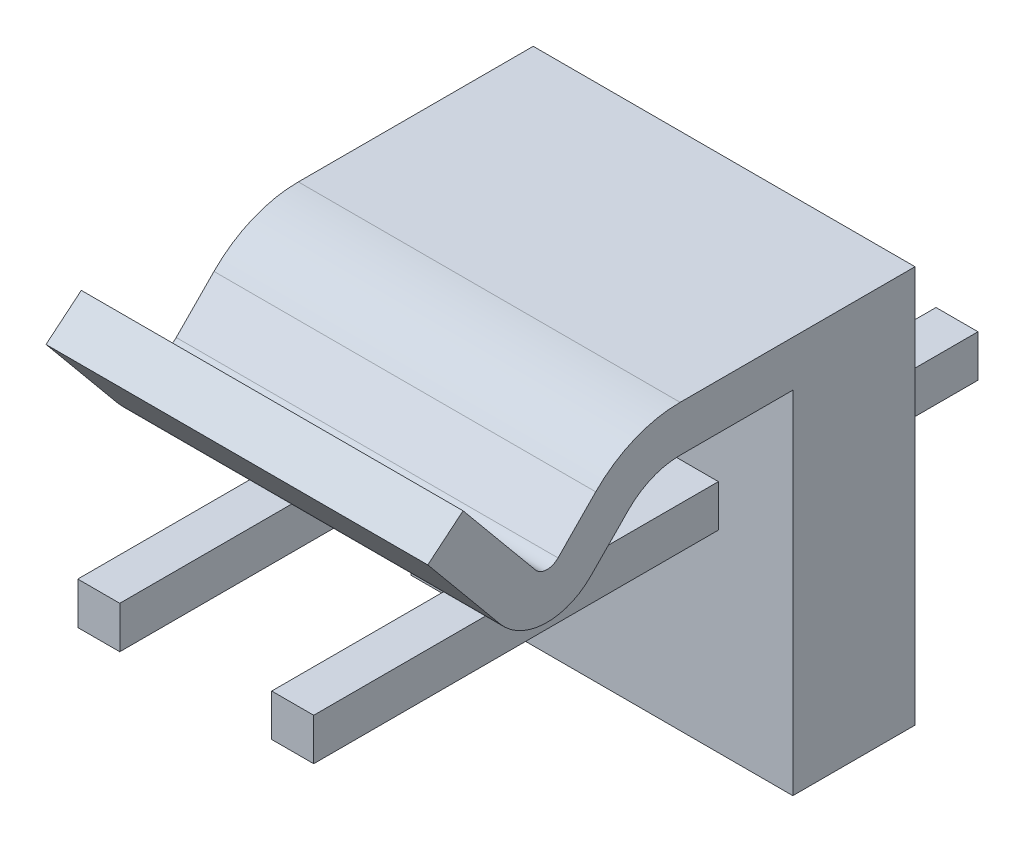
ISO-10303-21;
HEADER;
FILE_DESCRIPTION(('STEP AP214'),'2;1');
FILE_NAME('part.step','',(''),(''),'','','');
FILE_SCHEMA(('AUTOMOTIVE_DESIGN { 1 0 10303 214 1 1 1 1 }'));
ENDSEC;
DATA;
#1=APPLICATION_CONTEXT('core data for automotive mechanical design processes');
#2=APPLICATION_PROTOCOL_DEFINITION('international standard','automotive_design',2000,#1);
#3=PRODUCT_CONTEXT('',#1,'mechanical');
#4=PRODUCT('Part','Part','',(#3));
#5=PRODUCT_RELATED_PRODUCT_CATEGORY('part','',(#4));
#6=PRODUCT_DEFINITION_FORMATION('','',#4);
#7=PRODUCT_DEFINITION_CONTEXT('part definition',#1,'design');
#8=PRODUCT_DEFINITION('design','',#6,#7);
#9=PRODUCT_DEFINITION_SHAPE('','',#8);
#10=(LENGTH_UNIT() NAMED_UNIT(*) SI_UNIT(.MILLI.,.METRE.));
#11=(NAMED_UNIT(*) PLANE_ANGLE_UNIT() SI_UNIT($,.RADIAN.));
#12=(NAMED_UNIT(*) SI_UNIT($,.STERADIAN.) SOLID_ANGLE_UNIT());
#13=UNCERTAINTY_MEASURE_WITH_UNIT(LENGTH_MEASURE(1.E-05),#10,'distance_accuracy_value','');
#14=(GEOMETRIC_REPRESENTATION_CONTEXT(3) GLOBAL_UNCERTAINTY_ASSIGNED_CONTEXT((#13)) GLOBAL_UNIT_ASSIGNED_CONTEXT((#10,
#11,#12)) REPRESENTATION_CONTEXT('',''));
#15=CARTESIAN_POINT('',(0.,0.,0.));
#16=DIRECTION('',(0.,0.,1.));
#17=DIRECTION('',(1.,0.,0.));
#18=AXIS2_PLACEMENT_3D('',#15,#16,#17);
#19=CARTESIAN_POINT('',(12.58,4.8,3.2));
#20=DIRECTION('',(0.,-1.,0.));
#21=DIRECTION('',(0.,0.,-1.));
#22=AXIS2_PLACEMENT_3D('',#19,#20,#21);
#23=PLANE('',#22);
#24=DIRECTION('',(-1.,0.,0.));
#25=VECTOR('',#24,1.);
#26=CARTESIAN_POINT('',(-2.42,4.8,6.15256593385051));
#27=LINE('',#26,#25);
#28=CARTESIAN_POINT('',(7.58,4.8,6.15256593385051));
#29=VERTEX_POINT('',#28);
#30=CARTESIAN_POINT('',(-2.42,4.8,6.15256593385051));
#31=VERTEX_POINT('',#30);
#32=EDGE_CURVE('E377',#29,#31,#27,.T.);
#33=ORIENTED_EDGE('',*,*,#32,.F.);
#34=DIRECTION('',(0.,0.,-1.));
#35=VECTOR('',#34,1.);
#36=CARTESIAN_POINT('',(7.58,4.8,3.2));
#37=LINE('',#36,#35);
#38=CARTESIAN_POINT('',(7.58,4.8,0.));
#39=VERTEX_POINT('',#38);
#40=EDGE_CURVE('E430',#29,#39,#37,.T.);
#41=ORIENTED_EDGE('',*,*,#40,.T.);
#42=DIRECTION('',(-1.,0.,0.));
#43=VECTOR('',#42,1.);
#44=CARTESIAN_POINT('',(12.58,4.8,0.));
#45=LINE('',#44,#43);
#46=CARTESIAN_POINT('',(-2.42,4.8,0.));
#47=VERTEX_POINT('',#46);
#48=EDGE_CURVE('E358',#39,#47,#45,.T.);
#49=ORIENTED_EDGE('',*,*,#48,.T.);
#50=DIRECTION('',(0.,0.,-1.));
#51=VECTOR('',#50,1.);
#52=CARTESIAN_POINT('',(-2.42,4.8,3.2));
#53=LINE('',#52,#51);
#54=EDGE_CURVE('E461',#31,#47,#53,.T.);
#55=ORIENTED_EDGE('',*,*,#54,.F.);
#56=EDGE_LOOP('',(#33,#41,#49,#55));
#57=FACE_BOUND('',#56,.T.);
#58=ADVANCED_FACE('F33',(#57),#23,.F.);
#59=CARTESIAN_POINT('',(-2.42,4.8,3.2));
#60=DIRECTION('',(1.,0.,0.));
#61=DIRECTION('',(0.,0.,-1.));
#62=AXIS2_PLACEMENT_3D('',#59,#60,#61);
#63=PLANE('',#62);
#64=DIRECTION('',(0.,-1.,0.));
#65=VECTOR('',#64,1.);
#66=CARTESIAN_POINT('',(-2.42,4.8,0.));
#67=LINE('',#66,#65);
#68=CARTESIAN_POINT('',(-2.42,-5.6,0.));
#69=VERTEX_POINT('',#68);
#70=EDGE_CURVE('E580',#47,#69,#67,.T.);
#71=ORIENTED_EDGE('',*,*,#70,.T.);
#72=DIRECTION('',(0.,0.,-1.));
#73=VECTOR('',#72,1.);
#74=CARTESIAN_POINT('',(-2.42,-5.6,3.2));
#75=LINE('',#74,#73);
#76=CARTESIAN_POINT('',(-2.42,-5.6,3.2));
#77=VERTEX_POINT('',#76);
#78=EDGE_CURVE('E455',#77,#69,#75,.T.);
#79=ORIENTED_EDGE('',*,*,#78,.F.);
#80=DIRECTION('',(0.,-1.,0.));
#81=VECTOR('',#80,1.);
#82=CARTESIAN_POINT('',(-2.42,4.8,3.2));
#83=LINE('',#82,#81);
#84=CARTESIAN_POINT('',(-2.42,3.6,3.2));
#85=VERTEX_POINT('',#84);
#86=EDGE_CURVE('E364',#85,#77,#83,.T.);
#87=ORIENTED_EDGE('',*,*,#86,.F.);
#88=DIRECTION('',(0.,0.,-1.));
#89=VECTOR('',#88,1.);
#90=CARTESIAN_POINT('',(-2.42,3.6,6.15256593385051));
#91=LINE('',#90,#89);
#92=CARTESIAN_POINT('',(-2.42,3.6,6.15256593385051));
#93=VERTEX_POINT('',#92);
#94=EDGE_CURVE('E373',#93,#85,#91,.T.);
#95=ORIENTED_EDGE('',*,*,#94,.F.);
#96=CARTESIAN_POINT('',(-2.42,1.7,6.15256593385051));
#97=DIRECTION('',(1.,0.,0.));
#98=DIRECTION('',(0.,0.,-1.));
#99=AXIS2_PLACEMENT_3D('',#96,#97,#98);
#100=CIRCLE('',#99,1.9);
#101=CARTESIAN_POINT('',(-2.42,3.03255997829624,7.50692331070609));
#102=VERTEX_POINT('',#101);
#103=EDGE_CURVE('E387',#93,#102,#100,.T.);
#104=ORIENTED_EDGE('',*,*,#103,.T.);
#105=DIRECTION('',(0.,-0.712819672029253,0.70134735699802));
#106=VECTOR('',#105,1.);
#107=CARTESIAN_POINT('',(-2.42,3.03255997829624,7.50692331070609));
#108=LINE('',#107,#106);
#109=CARTESIAN_POINT('',(-2.42,2.02784422880317,8.49546888975168));
#110=VERTEX_POINT('',#109);
#111=EDGE_CURVE('E398',#102,#110,#108,.T.);
#112=ORIENTED_EDGE('',*,*,#111,.T.);
#113=CARTESIAN_POINT('',(-2.42,3.15,9.63598036499848));
#114=DIRECTION('',(-1.,0.,0.));
#115=DIRECTION('',(0.,0.,1.));
#116=AXIS2_PLACEMENT_3D('',#113,#114,#115);
#117=CIRCLE('',#116,1.6);
#118=CARTESIAN_POINT('',(-2.42,2.12974270931486,10.8684879961326));
#119=VERTEX_POINT('',#118);
#120=EDGE_CURVE('E407',#110,#119,#117,.T.);
#121=ORIENTED_EDGE('',*,*,#120,.T.);
#122=DIRECTION('',(0.,0.77031726945882,0.637660806678212));
#123=VECTOR('',#122,1.);
#124=CARTESIAN_POINT('',(-2.42,2.12974270931486,10.8684879961326));
#125=LINE('',#124,#123);
#126=CARTESIAN_POINT('',(-2.42,4.41740351599307,12.7621903616753));
#127=VERTEX_POINT('',#126);
#128=EDGE_CURVE('E250',#119,#127,#125,.T.);
#129=ORIENTED_EDGE('',*,*,#128,.T.);
#130=DIRECTION('',(0.,-0.637660806678213,0.770317269458819));
#131=VECTOR('',#130,1.);
#132=CARTESIAN_POINT('',(-2.42,5.18259648400693,11.8378096383247));
#133=LINE('',#132,#131);
#134=CARTESIAN_POINT('',(-2.42,5.18259648400693,11.8378096383247));
#135=VERTEX_POINT('',#134);
#136=EDGE_CURVE('E244',#135,#127,#133,.T.);
#137=ORIENTED_EDGE('',*,*,#136,.F.);
#138=DIRECTION('',(0.,0.77031726945882,0.637660806678212));
#139=VECTOR('',#138,1.);
#140=CARTESIAN_POINT('',(-2.42,2.89493567732872,9.94410727278201));
#141=LINE('',#140,#139);
#142=CARTESIAN_POINT('',(-2.42,2.89493567732872,9.94410727278201));
#143=VERTEX_POINT('',#142);
#144=EDGE_CURVE('E246',#143,#135,#141,.T.);
#145=ORIENTED_EDGE('',*,*,#144,.F.);
#146=CARTESIAN_POINT('',(-2.42,3.15,9.63598036499848));
#147=DIRECTION('',(-1.,0.,0.));
#148=DIRECTION('',(0.,0.,1.));
#149=AXIS2_PLACEMENT_3D('',#146,#147,#148);
#150=CIRCLE('',#149,0.399999999999999);
#151=CARTESIAN_POINT('',(-2.42,2.86946105720079,9.35085249618678));
#152=VERTEX_POINT('',#151);
#153=EDGE_CURVE('E404',#152,#143,#150,.T.);
#154=ORIENTED_EDGE('',*,*,#153,.F.);
#155=DIRECTION('',(0.,-0.712819672029253,0.70134735699802));
#156=VECTOR('',#155,1.);
#157=CARTESIAN_POINT('',(-2.42,3.87417680669386,8.36230691714119));
#158=LINE('',#157,#156);
#159=CARTESIAN_POINT('',(-2.42,3.87417680669386,8.36230691714119));
#160=VERTEX_POINT('',#159);
#161=EDGE_CURVE('E395',#160,#152,#158,.T.);
#162=ORIENTED_EDGE('',*,*,#161,.F.);
#163=CARTESIAN_POINT('',(-2.42,1.7,6.15256593385051));
#164=DIRECTION('',(1.,0.,0.));
#165=DIRECTION('',(0.,0.,-1.));
#166=AXIS2_PLACEMENT_3D('',#163,#164,#165);
#167=CIRCLE('',#166,3.1);
#168=EDGE_CURVE('E384',#31,#160,#167,.T.);
#169=ORIENTED_EDGE('',*,*,#168,.F.);
#170=ORIENTED_EDGE('',*,*,#54,.T.);
#171=EDGE_LOOP('',(#71,#79,#87,#95,#104,#112,#121,#129,#137,#145,#154,#162,#169,#170));
#172=FACE_BOUND('',#171,.T.);
#173=ADVANCED_FACE('F410',(#172),#63,.F.);
#174=CARTESIAN_POINT('',(-2.42,-5.6,3.2));
#175=DIRECTION('',(0.,1.,0.));
#176=DIRECTION('',(0.,0.,1.));
#177=AXIS2_PLACEMENT_3D('',#174,#175,#176);
#178=PLANE('',#177);
#179=DIRECTION('',(1.,0.,0.));
#180=VECTOR('',#179,1.);
#181=CARTESIAN_POINT('',(-2.42,-5.6,0.));
#182=LINE('',#181,#180);
#183=CARTESIAN_POINT('',(7.58,-5.6,0.));
#184=VERTEX_POINT('',#183);
#185=EDGE_CURVE('E367',#69,#184,#182,.T.);
#186=ORIENTED_EDGE('',*,*,#185,.T.);
#187=DIRECTION('',(0.,0.,1.));
#188=VECTOR('',#187,1.);
#189=CARTESIAN_POINT('',(7.58,-5.6,3.2));
#190=LINE('',#189,#188);
#191=CARTESIAN_POINT('',(7.58,-5.6,3.2));
#192=VERTEX_POINT('',#191);
#193=EDGE_CURVE('E372',#184,#192,#190,.T.);
#194=ORIENTED_EDGE('',*,*,#193,.T.);
#195=DIRECTION('',(1.,0.,0.));
#196=VECTOR('',#195,1.);
#197=CARTESIAN_POINT('',(-2.42,-5.6,3.2));
#198=LINE('',#197,#196);
#199=EDGE_CURVE('E361',#77,#192,#198,.T.);
#200=ORIENTED_EDGE('',*,*,#199,.F.);
#201=ORIENTED_EDGE('',*,*,#78,.T.);
#202=EDGE_LOOP('',(#186,#194,#200,#201));
#203=FACE_BOUND('',#202,.T.);
#204=ADVANCED_FACE('F526',(#203),#178,.F.);
#205=CARTESIAN_POINT('',(-2.42,4.8,3.2));
#206=DIRECTION('',(0.,0.,1.));
#207=DIRECTION('',(1.,0.,0.));
#208=AXIS2_PLACEMENT_3D('',#205,#206,#207);
#209=PLANE('',#208);
#210=DIRECTION('',(0.,-1.,0.));
#211=VECTOR('',#210,1.);
#212=CARTESIAN_POINT('',(7.58,4.8,3.2));
#213=LINE('',#212,#211);
#214=CARTESIAN_POINT('',(7.58,3.6,3.2));
#215=VERTEX_POINT('',#214);
#216=EDGE_CURVE('E439',#215,#192,#213,.T.);
#217=ORIENTED_EDGE('',*,*,#216,.F.);
#218=DIRECTION('',(1.,0.,0.));
#219=VECTOR('',#218,1.);
#220=CARTESIAN_POINT('',(-2.42,3.6,3.2));
#221=LINE('',#220,#219);
#222=EDGE_CURVE('E54',#85,#215,#221,.T.);
#223=ORIENTED_EDGE('',*,*,#222,.F.);
#224=ORIENTED_EDGE('',*,*,#86,.T.);
#225=ORIENTED_EDGE('',*,*,#199,.T.);
#226=EDGE_LOOP('',(#217,#223,#224,#225));
#227=FACE_BOUND('',#226,.T.);
#228=DIRECTION('',(0.,-1.,0.));
#229=VECTOR('',#228,1.);
#230=CARTESIAN_POINT('',(4.53,4.8,3.2));
#231=LINE('',#230,#229);
#232=CARTESIAN_POINT('',(4.53,0.55,3.2));
#233=VERTEX_POINT('',#232);
#234=CARTESIAN_POINT('',(4.53,-0.55,3.2));
#235=VERTEX_POINT('',#234);
#236=EDGE_CURVE('E304',#233,#235,#231,.T.);
#237=ORIENTED_EDGE('',*,*,#236,.F.);
#238=DIRECTION('',(-1.,0.,0.));
#239=VECTOR('',#238,1.);
#240=CARTESIAN_POINT('',(-2.42,0.55,3.2));
#241=LINE('',#240,#239);
#242=CARTESIAN_POINT('',(5.63,0.55,3.2));
#243=VERTEX_POINT('',#242);
#244=EDGE_CURVE('E301',#243,#233,#241,.T.);
#245=ORIENTED_EDGE('',*,*,#244,.F.);
#246=DIRECTION('',(0.,1.,0.));
#247=VECTOR('',#246,1.);
#248=CARTESIAN_POINT('',(5.63,4.8,3.2));
#249=LINE('',#248,#247);
#250=CARTESIAN_POINT('',(5.63,-0.55,3.2));
#251=VERTEX_POINT('',#250);
#252=EDGE_CURVE('E298',#251,#243,#249,.T.);
#253=ORIENTED_EDGE('',*,*,#252,.F.);
#254=DIRECTION('',(1.,0.,0.));
#255=VECTOR('',#254,1.);
#256=CARTESIAN_POINT('',(-2.42,-0.55,3.2));
#257=LINE('',#256,#255);
#258=EDGE_CURVE('E284',#235,#251,#257,.T.);
#259=ORIENTED_EDGE('',*,*,#258,.F.);
#260=EDGE_LOOP('',(#237,#245,#253,#259));
#261=FACE_BOUND('',#260,.T.);
#262=DIRECTION('',(0.,-1.,0.));
#263=VECTOR('',#262,1.);
#264=CARTESIAN_POINT('',(-0.55,4.8,3.2));
#265=LINE('',#264,#263);
#266=CARTESIAN_POINT('',(-0.55,0.55,3.2));
#267=VERTEX_POINT('',#266);
#268=CARTESIAN_POINT('',(-0.55,-0.55,3.2));
#269=VERTEX_POINT('',#268);
#270=EDGE_CURVE('E355',#267,#269,#265,.T.);
#271=ORIENTED_EDGE('',*,*,#270,.F.);
#272=DIRECTION('',(-1.,0.,0.));
#273=VECTOR('',#272,1.);
#274=CARTESIAN_POINT('',(-2.42,0.55,3.2));
#275=LINE('',#274,#273);
#276=CARTESIAN_POINT('',(0.55,0.55,3.2));
#277=VERTEX_POINT('',#276);
#278=EDGE_CURVE('E352',#277,#267,#275,.T.);
#279=ORIENTED_EDGE('',*,*,#278,.F.);
#280=DIRECTION('',(0.,1.,0.));
#281=VECTOR('',#280,1.);
#282=CARTESIAN_POINT('',(0.55,4.8,3.2));
#283=LINE('',#282,#281);
#284=CARTESIAN_POINT('',(0.55,-0.55,3.2));
#285=VERTEX_POINT('',#284);
#286=EDGE_CURVE('E349',#285,#277,#283,.T.);
#287=ORIENTED_EDGE('',*,*,#286,.F.);
#288=DIRECTION('',(1.,0.,0.));
#289=VECTOR('',#288,1.);
#290=CARTESIAN_POINT('',(-2.42,-0.55,3.2));
#291=LINE('',#290,#289);
#292=EDGE_CURVE('E335',#269,#285,#291,.T.);
#293=ORIENTED_EDGE('',*,*,#292,.F.);
#294=EDGE_LOOP('',(#271,#279,#287,#293));
#295=FACE_BOUND('',#294,.T.);
#296=ADVANCED_FACE('F458',(#227,#261,#295),#209,.T.);
#297=CARTESIAN_POINT('',(-2.42,4.8,0.));
#298=DIRECTION('',(0.,0.,1.));
#299=DIRECTION('',(1.,0.,0.));
#300=AXIS2_PLACEMENT_3D('',#297,#298,#299);
#301=PLANE('',#300);
#302=DIRECTION('',(-1.,0.,0.));
#303=VECTOR('',#302,1.);
#304=CARTESIAN_POINT('',(-2.42,0.55,0.));
#305=LINE('',#304,#303);
#306=CARTESIAN_POINT('',(5.63,0.55,0.));
#307=VERTEX_POINT('',#306);
#308=CARTESIAN_POINT('',(4.53,0.55,0.));
#309=VERTEX_POINT('',#308);
#310=EDGE_CURVE('E487',#307,#309,#305,.T.);
#311=ORIENTED_EDGE('',*,*,#310,.T.);
#312=DIRECTION('',(0.,-1.,0.));
#313=VECTOR('',#312,1.);
#314=CARTESIAN_POINT('',(4.53,4.8,0.));
#315=LINE('',#314,#313);
#316=CARTESIAN_POINT('',(4.53,-0.55,0.));
#317=VERTEX_POINT('',#316);
#318=EDGE_CURVE('E40',#309,#317,#315,.T.);
#319=ORIENTED_EDGE('',*,*,#318,.T.);
#320=DIRECTION('',(1.,0.,0.));
#321=VECTOR('',#320,1.);
#322=CARTESIAN_POINT('',(-2.42,-0.55,0.));
#323=LINE('',#322,#321);
#324=CARTESIAN_POINT('',(5.63,-0.55,0.));
#325=VERTEX_POINT('',#324);
#326=EDGE_CURVE('E482',#317,#325,#323,.T.);
#327=ORIENTED_EDGE('',*,*,#326,.T.);
#328=DIRECTION('',(0.,1.,0.));
#329=VECTOR('',#328,1.);
#330=CARTESIAN_POINT('',(5.63,4.8,0.));
#331=LINE('',#330,#329);
#332=EDGE_CURVE('E485',#325,#307,#331,.T.);
#333=ORIENTED_EDGE('',*,*,#332,.T.);
#334=EDGE_LOOP('',(#311,#319,#327,#333));
#335=FACE_BOUND('',#334,.T.);
#336=DIRECTION('',(-1.,0.,0.));
#337=VECTOR('',#336,1.);
#338=CARTESIAN_POINT('',(-2.42,0.55,0.));
#339=LINE('',#338,#337);
#340=CARTESIAN_POINT('',(0.55,0.55,0.));
#341=VERTEX_POINT('',#340);
#342=CARTESIAN_POINT('',(-0.55,0.55,0.));
#343=VERTEX_POINT('',#342);
#344=EDGE_CURVE('E476',#341,#343,#339,.T.);
#345=ORIENTED_EDGE('',*,*,#344,.T.);
#346=DIRECTION('',(0.,-1.,0.));
#347=VECTOR('',#346,1.);
#348=CARTESIAN_POINT('',(-0.55,4.8,0.));
#349=LINE('',#348,#347);
#350=CARTESIAN_POINT('',(-0.55,-0.55,0.));
#351=VERTEX_POINT('',#350);
#352=EDGE_CURVE('E479',#343,#351,#349,.T.);
#353=ORIENTED_EDGE('',*,*,#352,.T.);
#354=DIRECTION('',(1.,0.,0.));
#355=VECTOR('',#354,1.);
#356=CARTESIAN_POINT('',(-2.42,-0.55,0.));
#357=LINE('',#356,#355);
#358=CARTESIAN_POINT('',(0.55,-0.55,0.));
#359=VERTEX_POINT('',#358);
#360=EDGE_CURVE('E466',#351,#359,#357,.T.);
#361=ORIENTED_EDGE('',*,*,#360,.T.);
#362=DIRECTION('',(0.,1.,0.));
#363=VECTOR('',#362,1.);
#364=CARTESIAN_POINT('',(0.55,4.8,0.));
#365=LINE('',#364,#363);
#366=EDGE_CURVE('E473',#359,#341,#365,.T.);
#367=ORIENTED_EDGE('',*,*,#366,.T.);
#368=EDGE_LOOP('',(#345,#353,#361,#367));
#369=FACE_BOUND('',#368,.T.);
#370=ORIENTED_EDGE('',*,*,#48,.F.);
#371=DIRECTION('',(0.,-1.,0.));
#372=VECTOR('',#371,1.);
#373=CARTESIAN_POINT('',(7.58,4.8,0.));
#374=LINE('',#373,#372);
#375=EDGE_CURVE('E436',#39,#184,#374,.T.);
#376=ORIENTED_EDGE('',*,*,#375,.T.);
#377=ORIENTED_EDGE('',*,*,#185,.F.);
#378=ORIENTED_EDGE('',*,*,#70,.F.);
#379=EDGE_LOOP('',(#370,#376,#377,#378));
#380=FACE_BOUND('',#379,.T.);
#381=ADVANCED_FACE('F491',(#335,#369,#380),#301,.F.);
#382=CARTESIAN_POINT('',(-0.55,-0.55,-3.6));
#383=DIRECTION('',(0.,0.,1.));
#384=DIRECTION('',(1.,0.,0.));
#385=AXIS2_PLACEMENT_3D('',#382,#383,#384);
#386=PLANE('',#385);
#387=CARTESIAN_POINT('',(0.,0.,-3.6));
#388=DIRECTION('',(0.,0.,-1.));
#389=DIRECTION('',(-1.,0.,0.));
#390=AXIS2_PLACEMENT_3D('',#387,#388,#389);
#391=CIRCLE('',#390,0.25);
#392=CARTESIAN_POINT('',(-0.25,0.,-3.6));
#393=VERTEX_POINT('',#392);
#394=EDGE_CURVE('E546',#393,#393,#391,.T.);
#395=ORIENTED_EDGE('',*,*,#394,.F.);
#396=EDGE_LOOP('',(#395));
#397=FACE_BOUND('',#396,.T.);
#398=DIRECTION('',(0.,-1.,0.));
#399=VECTOR('',#398,1.);
#400=CARTESIAN_POINT('',(-0.55,0.55,-3.6));
#401=LINE('',#400,#399);
#402=CARTESIAN_POINT('',(-0.55,0.55,-3.6));
#403=VERTEX_POINT('',#402);
#404=CARTESIAN_POINT('',(-0.55,-0.55,-3.6));
#405=VERTEX_POINT('',#404);
#406=EDGE_CURVE('E319',#403,#405,#401,.T.);
#407=ORIENTED_EDGE('',*,*,#406,.F.);
#408=DIRECTION('',(-1.,0.,0.));
#409=VECTOR('',#408,1.);
#410=CARTESIAN_POINT('',(-0.55,0.55,-3.6));
#411=LINE('',#410,#409);
#412=CARTESIAN_POINT('',(0.55,0.55,-3.6));
#413=VERTEX_POINT('',#412);
#414=EDGE_CURVE('E328',#413,#403,#411,.T.);
#415=ORIENTED_EDGE('',*,*,#414,.F.);
#416=DIRECTION('',(0.,1.,0.));
#417=VECTOR('',#416,1.);
#418=CARTESIAN_POINT('',(0.55,0.55,-3.6));
#419=LINE('',#418,#417);
#420=CARTESIAN_POINT('',(0.55,-0.55,-3.6));
#421=VERTEX_POINT('',#420);
#422=EDGE_CURVE('E325',#421,#413,#419,.T.);
#423=ORIENTED_EDGE('',*,*,#422,.F.);
#424=DIRECTION('',(1.,0.,0.));
#425=VECTOR('',#424,1.);
#426=CARTESIAN_POINT('',(-0.55,-0.55,-3.6));
#427=LINE('',#426,#425);
#428=EDGE_CURVE('E322',#405,#421,#427,.T.);
#429=ORIENTED_EDGE('',*,*,#428,.F.);
#430=EDGE_LOOP('',(#407,#415,#423,#429));
#431=FACE_BOUND('',#430,.T.);
#432=ADVANCED_FACE('F560',(#397,#431),#386,.F.);
#433=CARTESIAN_POINT('',(-0.55,-0.55,-3.6));
#434=DIRECTION('',(0.,-1.,0.));
#435=DIRECTION('',(0.,0.,-1.));
#436=AXIS2_PLACEMENT_3D('',#433,#434,#435);
#437=PLANE('',#436);
#438=ORIENTED_EDGE('',*,*,#360,.F.);
#439=DIRECTION('',(0.,0.,1.));
#440=VECTOR('',#439,1.);
#441=CARTESIAN_POINT('',(-0.55,-0.55,-3.6));
#442=LINE('',#441,#440);
#443=EDGE_CURVE('E344',#405,#351,#442,.T.);
#444=ORIENTED_EDGE('',*,*,#443,.F.);
#445=ORIENTED_EDGE('',*,*,#428,.T.);
#446=DIRECTION('',(0.,0.,1.));
#447=VECTOR('',#446,1.);
#448=CARTESIAN_POINT('',(0.55,-0.55,-3.6));
#449=LINE('',#448,#447);
#450=EDGE_CURVE('E341',#421,#359,#449,.T.);
#451=ORIENTED_EDGE('',*,*,#450,.T.);
#452=EDGE_LOOP('',(#438,#444,#445,#451));
#453=FACE_BOUND('',#452,.T.);
#454=ADVANCED_FACE('F563',(#453),#437,.T.);
#455=CARTESIAN_POINT('',(0.55,0.55,-3.6));
#456=DIRECTION('',(1.,0.,0.));
#457=DIRECTION('',(0.,0.,-1.));
#458=AXIS2_PLACEMENT_3D('',#455,#456,#457);
#459=PLANE('',#458);
#460=ORIENTED_EDGE('',*,*,#366,.F.);
#461=ORIENTED_EDGE('',*,*,#450,.F.);
#462=ORIENTED_EDGE('',*,*,#422,.T.);
#463=DIRECTION('',(0.,0.,1.));
#464=VECTOR('',#463,1.);
#465=CARTESIAN_POINT('',(0.55,0.55,-3.6));
#466=LINE('',#465,#464);
#467=EDGE_CURVE('E337',#413,#341,#466,.T.);
#468=ORIENTED_EDGE('',*,*,#467,.T.);
#469=EDGE_LOOP('',(#460,#461,#462,#468));
#470=FACE_BOUND('',#469,.T.);
#471=ADVANCED_FACE('F574',(#470),#459,.T.);
#472=CARTESIAN_POINT('',(-0.55,0.55,-3.6));
#473=DIRECTION('',(0.,1.,0.));
#474=DIRECTION('',(0.,0.,1.));
#475=AXIS2_PLACEMENT_3D('',#472,#473,#474);
#476=PLANE('',#475);
#477=ORIENTED_EDGE('',*,*,#344,.F.);
#478=ORIENTED_EDGE('',*,*,#467,.F.);
#479=ORIENTED_EDGE('',*,*,#414,.T.);
#480=DIRECTION('',(0.,0.,1.));
#481=VECTOR('',#480,1.);
#482=CARTESIAN_POINT('',(-0.55,0.55,-3.6));
#483=LINE('',#482,#481);
#484=EDGE_CURVE('E332',#403,#343,#483,.T.);
#485=ORIENTED_EDGE('',*,*,#484,.T.);
#486=EDGE_LOOP('',(#477,#478,#479,#485));
#487=FACE_BOUND('',#486,.T.);
#488=ADVANCED_FACE('F571',(#487),#476,.T.);
#489=CARTESIAN_POINT('',(-0.55,0.55,-3.6));
#490=DIRECTION('',(-1.,0.,0.));
#491=DIRECTION('',(0.,0.,1.));
#492=AXIS2_PLACEMENT_3D('',#489,#490,#491);
#493=PLANE('',#492);
#494=ORIENTED_EDGE('',*,*,#352,.F.);
#495=ORIENTED_EDGE('',*,*,#484,.F.);
#496=ORIENTED_EDGE('',*,*,#406,.T.);
#497=ORIENTED_EDGE('',*,*,#443,.T.);
#498=EDGE_LOOP('',(#494,#495,#496,#497));
#499=FACE_BOUND('',#498,.T.);
#500=ADVANCED_FACE('F576',(#499),#493,.T.);
#501=CARTESIAN_POINT('',(-0.55,0.55,13.8));
#502=VERTEX_POINT('',#501);
#503=EDGE_CURVE('E336',#267,#502,#483,.T.);
#504=ORIENTED_EDGE('',*,*,#503,.F.);
#505=ORIENTED_EDGE('',*,*,#270,.T.);
#506=CARTESIAN_POINT('',(-0.55,-0.55,13.8));
#507=VERTEX_POINT('',#506);
#508=EDGE_CURVE('E331',#269,#507,#442,.T.);
#509=ORIENTED_EDGE('',*,*,#508,.T.);
#510=DIRECTION('',(0.,-1.,0.));
#511=VECTOR('',#510,1.);
#512=CARTESIAN_POINT('',(-0.55,0.55,13.8));
#513=LINE('',#512,#511);
#514=EDGE_CURVE('E307',#502,#507,#513,.T.);
#515=ORIENTED_EDGE('',*,*,#514,.F.);
#516=EDGE_LOOP('',(#504,#505,#509,#515));
#517=FACE_BOUND('',#516,.T.);
#518=ADVANCED_FACE('F638',(#517),#493,.T.);
#519=CARTESIAN_POINT('',(0.55,0.55,13.8));
#520=VERTEX_POINT('',#519);
#521=EDGE_CURVE('E340',#277,#520,#466,.T.);
#522=ORIENTED_EDGE('',*,*,#521,.F.);
#523=ORIENTED_EDGE('',*,*,#278,.T.);
#524=ORIENTED_EDGE('',*,*,#503,.T.);
#525=DIRECTION('',(-1.,0.,0.));
#526=VECTOR('',#525,1.);
#527=CARTESIAN_POINT('',(-0.55,0.55,13.8));
#528=LINE('',#527,#526);
#529=EDGE_CURVE('E316',#520,#502,#528,.T.);
#530=ORIENTED_EDGE('',*,*,#529,.F.);
#531=EDGE_LOOP('',(#522,#523,#524,#530));
#532=FACE_BOUND('',#531,.T.);
#533=ADVANCED_FACE('F635',(#532),#476,.T.);
#534=CARTESIAN_POINT('',(0.55,-0.55,13.8));
#535=VERTEX_POINT('',#534);
#536=EDGE_CURVE('E343',#285,#535,#449,.T.);
#537=ORIENTED_EDGE('',*,*,#536,.F.);
#538=ORIENTED_EDGE('',*,*,#286,.T.);
#539=ORIENTED_EDGE('',*,*,#521,.T.);
#540=DIRECTION('',(0.,1.,0.));
#541=VECTOR('',#540,1.);
#542=CARTESIAN_POINT('',(0.55,0.55,13.8));
#543=LINE('',#542,#541);
#544=EDGE_CURVE('E313',#535,#520,#543,.T.);
#545=ORIENTED_EDGE('',*,*,#544,.F.);
#546=EDGE_LOOP('',(#537,#538,#539,#545));
#547=FACE_BOUND('',#546,.T.);
#548=ADVANCED_FACE('F644',(#547),#459,.T.);
#549=ORIENTED_EDGE('',*,*,#508,.F.);
#550=ORIENTED_EDGE('',*,*,#292,.T.);
#551=ORIENTED_EDGE('',*,*,#536,.T.);
#552=DIRECTION('',(1.,0.,0.));
#553=VECTOR('',#552,1.);
#554=CARTESIAN_POINT('',(-0.55,-0.55,13.8));
#555=LINE('',#554,#553);
#556=EDGE_CURVE('E310',#507,#535,#555,.T.);
#557=ORIENTED_EDGE('',*,*,#556,.F.);
#558=EDGE_LOOP('',(#549,#550,#551,#557));
#559=FACE_BOUND('',#558,.T.);
#560=ADVANCED_FACE('F646',(#559),#437,.T.);
#561=CARTESIAN_POINT('',(-0.55,-0.55,13.8));
#562=DIRECTION('',(0.,0.,1.));
#563=DIRECTION('',(1.,0.,0.));
#564=AXIS2_PLACEMENT_3D('',#561,#562,#563);
#565=PLANE('',#564);
#566=ORIENTED_EDGE('',*,*,#514,.T.);
#567=ORIENTED_EDGE('',*,*,#556,.T.);
#568=ORIENTED_EDGE('',*,*,#544,.T.);
#569=ORIENTED_EDGE('',*,*,#529,.T.);
#570=EDGE_LOOP('',(#566,#567,#568,#569));
#571=FACE_BOUND('',#570,.T.);
#572=ADVANCED_FACE('F609',(#571),#565,.T.);
#573=CARTESIAN_POINT('',(4.53,-0.55,-3.6));
#574=DIRECTION('',(0.,0.,1.));
#575=DIRECTION('',(1.,0.,0.));
#576=AXIS2_PLACEMENT_3D('',#573,#574,#575);
#577=PLANE('',#576);
#578=DIRECTION('',(0.,-1.,0.));
#579=VECTOR('',#578,1.);
#580=CARTESIAN_POINT('',(4.53,0.55,-3.6));
#581=LINE('',#580,#579);
#582=CARTESIAN_POINT('',(4.53,0.55,-3.6));
#583=VERTEX_POINT('',#582);
#584=CARTESIAN_POINT('',(4.53,-0.55,-3.6));
#585=VERTEX_POINT('',#584);
#586=EDGE_CURVE('E268',#583,#585,#581,.T.);
#587=ORIENTED_EDGE('',*,*,#586,.F.);
#588=DIRECTION('',(-1.,0.,0.));
#589=VECTOR('',#588,1.);
#590=CARTESIAN_POINT('',(4.53,0.55,-3.6));
#591=LINE('',#590,#589);
#592=CARTESIAN_POINT('',(5.63,0.55,-3.6));
#593=VERTEX_POINT('',#592);
#594=EDGE_CURVE('E277',#593,#583,#591,.T.);
#595=ORIENTED_EDGE('',*,*,#594,.F.);
#596=DIRECTION('',(0.,1.,0.));
#597=VECTOR('',#596,1.);
#598=CARTESIAN_POINT('',(5.63,0.55,-3.6));
#599=LINE('',#598,#597);
#600=CARTESIAN_POINT('',(5.63,-0.55,-3.6));
#601=VERTEX_POINT('',#600);
#602=EDGE_CURVE('E274',#601,#593,#599,.T.);
#603=ORIENTED_EDGE('',*,*,#602,.F.);
#604=DIRECTION('',(1.,0.,0.));
#605=VECTOR('',#604,1.);
#606=CARTESIAN_POINT('',(4.53,-0.55,-3.6));
#607=LINE('',#606,#605);
#608=EDGE_CURVE('E271',#585,#601,#607,.T.);
#609=ORIENTED_EDGE('',*,*,#608,.F.);
#610=EDGE_LOOP('',(#587,#595,#603,#609));
#611=FACE_BOUND('',#610,.T.);
#612=ADVANCED_FACE('F501',(#611),#577,.F.);
#613=CARTESIAN_POINT('',(4.53,-0.55,-3.6));
#614=DIRECTION('',(0.,-1.,0.));
#615=DIRECTION('',(0.,0.,-1.));
#616=AXIS2_PLACEMENT_3D('',#613,#614,#615);
#617=PLANE('',#616);
#618=ORIENTED_EDGE('',*,*,#326,.F.);
#619=DIRECTION('',(0.,0.,1.));
#620=VECTOR('',#619,1.);
#621=CARTESIAN_POINT('',(4.53,-0.55,-3.6));
#622=LINE('',#621,#620);
#623=EDGE_CURVE('E293',#585,#317,#622,.T.);
#624=ORIENTED_EDGE('',*,*,#623,.F.);
#625=ORIENTED_EDGE('',*,*,#608,.T.);
#626=DIRECTION('',(0.,0.,1.));
#627=VECTOR('',#626,1.);
#628=CARTESIAN_POINT('',(5.63,-0.55,-3.6));
#629=LINE('',#628,#627);
#630=EDGE_CURVE('E290',#601,#325,#629,.T.);
#631=ORIENTED_EDGE('',*,*,#630,.T.);
#632=EDGE_LOOP('',(#618,#624,#625,#631));
#633=FACE_BOUND('',#632,.T.);
#634=ADVANCED_FACE('F504',(#633),#617,.T.);
#635=CARTESIAN_POINT('',(5.63,0.55,-3.6));
#636=DIRECTION('',(1.,0.,0.));
#637=DIRECTION('',(0.,0.,-1.));
#638=AXIS2_PLACEMENT_3D('',#635,#636,#637);
#639=PLANE('',#638);
#640=ORIENTED_EDGE('',*,*,#332,.F.);
#641=ORIENTED_EDGE('',*,*,#630,.F.);
#642=ORIENTED_EDGE('',*,*,#602,.T.);
#643=DIRECTION('',(0.,0.,1.));
#644=VECTOR('',#643,1.);
#645=CARTESIAN_POINT('',(5.63,0.55,-3.6));
#646=LINE('',#645,#644);
#647=EDGE_CURVE('E286',#593,#307,#646,.T.);
#648=ORIENTED_EDGE('',*,*,#647,.T.);
#649=EDGE_LOOP('',(#640,#641,#642,#648));
#650=FACE_BOUND('',#649,.T.);
#651=ADVANCED_FACE('F507',(#650),#639,.T.);
#652=CARTESIAN_POINT('',(4.53,0.55,-3.6));
#653=DIRECTION('',(0.,1.,0.));
#654=DIRECTION('',(0.,0.,1.));
#655=AXIS2_PLACEMENT_3D('',#652,#653,#654);
#656=PLANE('',#655);
#657=ORIENTED_EDGE('',*,*,#310,.F.);
#658=ORIENTED_EDGE('',*,*,#647,.F.);
#659=ORIENTED_EDGE('',*,*,#594,.T.);
#660=DIRECTION('',(0.,0.,1.));
#661=VECTOR('',#660,1.);
#662=CARTESIAN_POINT('',(4.53,0.55,-3.6));
#663=LINE('',#662,#661);
#664=EDGE_CURVE('E281',#583,#309,#663,.T.);
#665=ORIENTED_EDGE('',*,*,#664,.T.);
#666=EDGE_LOOP('',(#657,#658,#659,#665));
#667=FACE_BOUND('',#666,.T.);
#668=ADVANCED_FACE('F497',(#667),#656,.T.);
#669=CARTESIAN_POINT('',(4.53,0.55,-3.6));
#670=DIRECTION('',(-1.,0.,0.));
#671=DIRECTION('',(0.,0.,1.));
#672=AXIS2_PLACEMENT_3D('',#669,#670,#671);
#673=PLANE('',#672);
#674=ORIENTED_EDGE('',*,*,#318,.F.);
#675=ORIENTED_EDGE('',*,*,#664,.F.);
#676=ORIENTED_EDGE('',*,*,#586,.T.);
#677=ORIENTED_EDGE('',*,*,#623,.T.);
#678=EDGE_LOOP('',(#674,#675,#676,#677));
#679=FACE_BOUND('',#678,.T.);
#680=ADVANCED_FACE('F494',(#679),#673,.T.);
#681=CARTESIAN_POINT('',(4.53,0.55,13.8));
#682=VERTEX_POINT('',#681);
#683=EDGE_CURVE('E285',#233,#682,#663,.T.);
#684=ORIENTED_EDGE('',*,*,#683,.F.);
#685=ORIENTED_EDGE('',*,*,#236,.T.);
#686=CARTESIAN_POINT('',(4.53,-0.55,13.8));
#687=VERTEX_POINT('',#686);
#688=EDGE_CURVE('E280',#235,#687,#622,.T.);
#689=ORIENTED_EDGE('',*,*,#688,.T.);
#690=DIRECTION('',(0.,-1.,0.));
#691=VECTOR('',#690,1.);
#692=CARTESIAN_POINT('',(4.53,0.55,13.8));
#693=LINE('',#692,#691);
#694=EDGE_CURVE('E256',#682,#687,#693,.T.);
#695=ORIENTED_EDGE('',*,*,#694,.F.);
#696=EDGE_LOOP('',(#684,#685,#689,#695));
#697=FACE_BOUND('',#696,.T.);
#698=ADVANCED_FACE('F611',(#697),#673,.T.);
#699=CARTESIAN_POINT('',(5.63,0.55,13.8));
#700=VERTEX_POINT('',#699);
#701=EDGE_CURVE('E289',#243,#700,#646,.T.);
#702=ORIENTED_EDGE('',*,*,#701,.F.);
#703=ORIENTED_EDGE('',*,*,#244,.T.);
#704=ORIENTED_EDGE('',*,*,#683,.T.);
#705=DIRECTION('',(-1.,0.,0.));
#706=VECTOR('',#705,1.);
#707=CARTESIAN_POINT('',(4.53,0.55,13.8));
#708=LINE('',#707,#706);
#709=EDGE_CURVE('E265',#700,#682,#708,.T.);
#710=ORIENTED_EDGE('',*,*,#709,.F.);
#711=EDGE_LOOP('',(#702,#703,#704,#710));
#712=FACE_BOUND('',#711,.T.);
#713=ADVANCED_FACE('F516',(#712),#656,.T.);
#714=CARTESIAN_POINT('',(5.63,-0.55,13.8));
#715=VERTEX_POINT('',#714);
#716=EDGE_CURVE('E292',#251,#715,#629,.T.);
#717=ORIENTED_EDGE('',*,*,#716,.F.);
#718=ORIENTED_EDGE('',*,*,#252,.T.);
#719=ORIENTED_EDGE('',*,*,#701,.T.);
#720=DIRECTION('',(0.,1.,0.));
#721=VECTOR('',#720,1.);
#722=CARTESIAN_POINT('',(5.63,0.55,13.8));
#723=LINE('',#722,#721);
#724=EDGE_CURVE('E262',#715,#700,#723,.T.);
#725=ORIENTED_EDGE('',*,*,#724,.F.);
#726=EDGE_LOOP('',(#717,#718,#719,#725));
#727=FACE_BOUND('',#726,.T.);
#728=ADVANCED_FACE('F510',(#727),#639,.T.);
#729=ORIENTED_EDGE('',*,*,#688,.F.);
#730=ORIENTED_EDGE('',*,*,#258,.T.);
#731=ORIENTED_EDGE('',*,*,#716,.T.);
#732=DIRECTION('',(1.,0.,0.));
#733=VECTOR('',#732,1.);
#734=CARTESIAN_POINT('',(4.53,-0.55,13.8));
#735=LINE('',#734,#733);
#736=EDGE_CURVE('E259',#687,#715,#735,.T.);
#737=ORIENTED_EDGE('',*,*,#736,.F.);
#738=EDGE_LOOP('',(#729,#730,#731,#737));
#739=FACE_BOUND('',#738,.T.);
#740=ADVANCED_FACE('F518',(#739),#617,.T.);
#741=CARTESIAN_POINT('',(4.53,-0.55,13.8));
#742=DIRECTION('',(0.,0.,1.));
#743=DIRECTION('',(1.,0.,0.));
#744=AXIS2_PLACEMENT_3D('',#741,#742,#743);
#745=PLANE('',#744);
#746=ORIENTED_EDGE('',*,*,#694,.T.);
#747=ORIENTED_EDGE('',*,*,#736,.T.);
#748=ORIENTED_EDGE('',*,*,#724,.T.);
#749=ORIENTED_EDGE('',*,*,#709,.T.);
#750=EDGE_LOOP('',(#746,#747,#748,#749));
#751=FACE_BOUND('',#750,.T.);
#752=ADVANCED_FACE('F604',(#751),#745,.T.);
#753=CARTESIAN_POINT('',(-2.42,2.12974270931486,10.8684879961326));
#754=DIRECTION('',(0.,-0.637660806678212,0.77031726945882));
#755=DIRECTION('',(0.,-0.77031726945882,-0.637660806678212));
#756=AXIS2_PLACEMENT_3D('',#753,#754,#755);
#757=PLANE('',#756);
#758=DIRECTION('',(0.,-0.77031726945882,-0.637660806678212));
#759=VECTOR('',#758,1.);
#760=CARTESIAN_POINT('',(7.58,2.12974270931486,10.8684879961326));
#761=LINE('',#760,#759);
#762=CARTESIAN_POINT('',(7.58,4.41740351599307,12.7621903616753));
#763=VERTEX_POINT('',#762);
#764=CARTESIAN_POINT('',(7.58,2.12974270931486,10.8684879961326));
#765=VERTEX_POINT('',#764);
#766=EDGE_CURVE('E228',#763,#765,#761,.T.);
#767=ORIENTED_EDGE('',*,*,#766,.F.);
#768=DIRECTION('',(1.,0.,0.));
#769=VECTOR('',#768,1.);
#770=CARTESIAN_POINT('',(-2.42,4.41740351599307,12.7621903616753));
#771=LINE('',#770,#769);
#772=EDGE_CURVE('E236',#127,#763,#771,.T.);
#773=ORIENTED_EDGE('',*,*,#772,.F.);
#774=ORIENTED_EDGE('',*,*,#128,.F.);
#775=DIRECTION('',(1.,0.,0.));
#776=VECTOR('',#775,1.);
#777=CARTESIAN_POINT('',(-2.42,2.12974270931486,10.8684879961326));
#778=LINE('',#777,#776);
#779=EDGE_CURVE('E239',#119,#765,#778,.T.);
#780=ORIENTED_EDGE('',*,*,#779,.T.);
#781=EDGE_LOOP('',(#767,#773,#774,#780));
#782=FACE_BOUND('',#781,.T.);
#783=ADVANCED_FACE('F235',(#782),#757,.T.);
#784=CARTESIAN_POINT('',(-2.42,2.89493567732872,9.94410727278201));
#785=DIRECTION('',(0.,0.637660806678212,-0.77031726945882));
#786=DIRECTION('',(0.,0.77031726945882,0.637660806678212));
#787=AXIS2_PLACEMENT_3D('',#784,#785,#786);
#788=PLANE('',#787);
#789=DIRECTION('',(0.,0.77031726945882,0.637660806678212));
#790=VECTOR('',#789,1.);
#791=CARTESIAN_POINT('',(7.58,2.89493567732872,9.94410727278201));
#792=LINE('',#791,#790);
#793=CARTESIAN_POINT('',(7.58,2.89493567732872,9.94410727278201));
#794=VERTEX_POINT('',#793);
#795=CARTESIAN_POINT('',(7.58,5.18259648400693,11.8378096383247));
#796=VERTEX_POINT('',#795);
#797=EDGE_CURVE('E46',#794,#796,#792,.T.);
#798=ORIENTED_EDGE('',*,*,#797,.F.);
#799=DIRECTION('',(-1.,0.,0.));
#800=VECTOR('',#799,1.);
#801=CARTESIAN_POINT('',(-2.42,2.89493567732872,9.94410727278201));
#802=LINE('',#801,#800);
#803=EDGE_CURVE('E401',#794,#143,#802,.T.);
#804=ORIENTED_EDGE('',*,*,#803,.T.);
#805=ORIENTED_EDGE('',*,*,#144,.T.);
#806=DIRECTION('',(-1.,0.,0.));
#807=VECTOR('',#806,1.);
#808=CARTESIAN_POINT('',(-2.42,5.18259648400693,11.8378096383247));
#809=LINE('',#808,#807);
#810=EDGE_CURVE('E247',#796,#135,#809,.T.);
#811=ORIENTED_EDGE('',*,*,#810,.F.);
#812=EDGE_LOOP('',(#798,#804,#805,#811));
#813=FACE_BOUND('',#812,.T.);
#814=ADVANCED_FACE('F598',(#813),#788,.T.);
#815=CARTESIAN_POINT('',(-2.42,3.15,9.63598036499848));
#816=DIRECTION('',(-1.,0.,0.));
#817=DIRECTION('',(0.,0.,1.));
#818=AXIS2_PLACEMENT_3D('',#815,#816,#817);
#819=CYLINDRICAL_SURFACE('',#818,1.6);
#820=CARTESIAN_POINT('',(7.58,3.15,9.63598036499848));
#821=DIRECTION('',(-1.,0.,0.));
#822=DIRECTION('',(0.,0.,1.));
#823=AXIS2_PLACEMENT_3D('',#820,#821,#822);
#824=CIRCLE('',#823,1.6);
#825=CARTESIAN_POINT('',(7.58,2.02784422880317,8.49546888975168));
#826=VERTEX_POINT('',#825);
#827=EDGE_CURVE('E425',#765,#826,#824,.F.);
#828=ORIENTED_EDGE('',*,*,#827,.F.);
#829=ORIENTED_EDGE('',*,*,#779,.F.);
#830=ORIENTED_EDGE('',*,*,#120,.F.);
#831=DIRECTION('',(1.,0.,0.));
#832=VECTOR('',#831,1.);
#833=CARTESIAN_POINT('',(-2.42,2.02784422880317,8.49546888975168));
#834=LINE('',#833,#832);
#835=EDGE_CURVE('E392',#110,#826,#834,.T.);
#836=ORIENTED_EDGE('',*,*,#835,.T.);
#837=EDGE_LOOP('',(#828,#829,#830,#836));
#838=FACE_BOUND('',#837,.T.);
#839=ADVANCED_FACE('F413',(#838),#819,.T.);
#840=CARTESIAN_POINT('',(-2.42,3.15,9.63598036499848));
#841=DIRECTION('',(-1.,0.,0.));
#842=DIRECTION('',(0.,0.,1.));
#843=AXIS2_PLACEMENT_3D('',#840,#841,#842);
#844=CYLINDRICAL_SURFACE('',#843,0.399999999999999);
#845=CARTESIAN_POINT('',(7.58,3.15,9.63598036499848));
#846=DIRECTION('',(-1.,0.,0.));
#847=DIRECTION('',(0.,0.,1.));
#848=AXIS2_PLACEMENT_3D('',#845,#846,#847);
#849=CIRCLE('',#848,0.399999999999999);
#850=CARTESIAN_POINT('',(7.58,2.86946105720079,9.35085249618678));
#851=VERTEX_POINT('',#850);
#852=EDGE_CURVE('E240',#851,#794,#849,.T.);
#853=ORIENTED_EDGE('',*,*,#852,.F.);
#854=DIRECTION('',(-1.,0.,0.));
#855=VECTOR('',#854,1.);
#856=CARTESIAN_POINT('',(-2.42,2.86946105720079,9.35085249618678));
#857=LINE('',#856,#855);
#858=EDGE_CURVE('E390',#851,#152,#857,.T.);
#859=ORIENTED_EDGE('',*,*,#858,.T.);
#860=ORIENTED_EDGE('',*,*,#153,.T.);
#861=ORIENTED_EDGE('',*,*,#803,.F.);
#862=EDGE_LOOP('',(#853,#859,#860,#861));
#863=FACE_BOUND('',#862,.T.);
#864=ADVANCED_FACE('F541',(#863),#844,.F.);
#865=CARTESIAN_POINT('',(-2.42,3.03255997829624,7.50692331070609));
#866=DIRECTION('',(0.,-0.70134735699802,-0.712819672029253));
#867=DIRECTION('',(0.,0.712819672029253,-0.70134735699802));
#868=AXIS2_PLACEMENT_3D('',#865,#866,#867);
#869=PLANE('',#868);
#870=DIRECTION('',(0.,0.712819672029253,-0.70134735699802));
#871=VECTOR('',#870,1.);
#872=CARTESIAN_POINT('',(7.58,3.03255997829624,7.50692331070609));
#873=LINE('',#872,#871);
#874=CARTESIAN_POINT('',(7.58,3.03255997829624,7.50692331070609));
#875=VERTEX_POINT('',#874);
#876=EDGE_CURVE('E418',#826,#875,#873,.T.);
#877=ORIENTED_EDGE('',*,*,#876,.F.);
#878=ORIENTED_EDGE('',*,*,#835,.F.);
#879=ORIENTED_EDGE('',*,*,#111,.F.);
#880=DIRECTION('',(1.,0.,0.));
#881=VECTOR('',#880,1.);
#882=CARTESIAN_POINT('',(-2.42,3.03255997829624,7.50692331070609));
#883=LINE('',#882,#881);
#884=EDGE_CURVE('E381',#102,#875,#883,.T.);
#885=ORIENTED_EDGE('',*,*,#884,.T.);
#886=EDGE_LOOP('',(#877,#878,#879,#885));
#887=FACE_BOUND('',#886,.T.);
#888=ADVANCED_FACE('F416',(#887),#869,.T.);
#889=CARTESIAN_POINT('',(-2.42,3.87417680669386,8.36230691714119));
#890=DIRECTION('',(0.,0.70134735699802,0.712819672029253));
#891=DIRECTION('',(0.,-0.712819672029253,0.70134735699802));
#892=AXIS2_PLACEMENT_3D('',#889,#890,#891);
#893=PLANE('',#892);
#894=DIRECTION('',(0.,-0.712819672029253,0.70134735699802));
#895=VECTOR('',#894,1.);
#896=CARTESIAN_POINT('',(7.58,3.87417680669386,8.36230691714119));
#897=LINE('',#896,#895);
#898=CARTESIAN_POINT('',(7.58,3.87417680669386,8.36230691714119));
#899=VERTEX_POINT('',#898);
#900=EDGE_CURVE('E421',#899,#851,#897,.T.);
#901=ORIENTED_EDGE('',*,*,#900,.F.);
#902=DIRECTION('',(-1.,0.,0.));
#903=VECTOR('',#902,1.);
#904=CARTESIAN_POINT('',(-2.42,3.87417680669386,8.36230691714119));
#905=LINE('',#904,#903);
#906=EDGE_CURVE('E379',#899,#160,#905,.T.);
#907=ORIENTED_EDGE('',*,*,#906,.T.);
#908=ORIENTED_EDGE('',*,*,#161,.T.);
#909=ORIENTED_EDGE('',*,*,#858,.F.);
#910=EDGE_LOOP('',(#901,#907,#908,#909));
#911=FACE_BOUND('',#910,.T.);
#912=ADVANCED_FACE('F536',(#911),#893,.T.);
#913=CARTESIAN_POINT('',(-2.42,1.7,6.15256593385051));
#914=DIRECTION('',(1.,0.,0.));
#915=DIRECTION('',(0.,0.,-1.));
#916=AXIS2_PLACEMENT_3D('',#913,#914,#915);
#917=CYLINDRICAL_SURFACE('',#916,1.9);
#918=CARTESIAN_POINT('',(7.58,1.7,6.15256593385051));
#919=DIRECTION('',(-1.,0.,0.));
#920=DIRECTION('',(0.,0.,1.));
#921=AXIS2_PLACEMENT_3D('',#918,#919,#920);
#922=CIRCLE('',#921,1.9);
#923=CARTESIAN_POINT('',(7.58,3.6,6.15256593385051));
#924=VERTEX_POINT('',#923);
#925=EDGE_CURVE('E423',#875,#924,#922,.T.);
#926=ORIENTED_EDGE('',*,*,#925,.F.);
#927=ORIENTED_EDGE('',*,*,#884,.F.);
#928=ORIENTED_EDGE('',*,*,#103,.F.);
#929=DIRECTION('',(1.,0.,0.));
#930=VECTOR('',#929,1.);
#931=CARTESIAN_POINT('',(-2.42,3.6,6.15256593385051));
#932=LINE('',#931,#930);
#933=EDGE_CURVE('E371',#93,#924,#932,.T.);
#934=ORIENTED_EDGE('',*,*,#933,.T.);
#935=EDGE_LOOP('',(#926,#927,#928,#934));
#936=FACE_BOUND('',#935,.T.);
#937=ADVANCED_FACE('F581',(#936),#917,.F.);
#938=CARTESIAN_POINT('',(-2.42,1.7,6.15256593385051));
#939=DIRECTION('',(1.,0.,0.));
#940=DIRECTION('',(0.,0.,-1.));
#941=AXIS2_PLACEMENT_3D('',#938,#939,#940);
#942=CYLINDRICAL_SURFACE('',#941,3.1);
#943=CARTESIAN_POINT('',(7.58,1.7,6.15256593385051));
#944=DIRECTION('',(-1.,0.,0.));
#945=DIRECTION('',(0.,0.,1.));
#946=AXIS2_PLACEMENT_3D('',#943,#944,#945);
#947=CIRCLE('',#946,3.1);
#948=EDGE_CURVE('E420',#29,#899,#947,.F.);
#949=ORIENTED_EDGE('',*,*,#948,.F.);
#950=ORIENTED_EDGE('',*,*,#32,.T.);
#951=ORIENTED_EDGE('',*,*,#168,.T.);
#952=ORIENTED_EDGE('',*,*,#906,.F.);
#953=EDGE_LOOP('',(#949,#950,#951,#952));
#954=FACE_BOUND('',#953,.T.);
#955=ADVANCED_FACE('F533',(#954),#942,.T.);
#956=CARTESIAN_POINT('',(-2.42,3.6,6.15256593385051));
#957=DIRECTION('',(0.,1.,0.));
#958=DIRECTION('',(0.,0.,1.));
#959=AXIS2_PLACEMENT_3D('',#956,#957,#958);
#960=PLANE('',#959);
#961=ORIENTED_EDGE('',*,*,#222,.T.);
#962=DIRECTION('',(0.,0.,1.));
#963=VECTOR('',#962,1.);
#964=CARTESIAN_POINT('',(7.58,3.6,6.15256593385051));
#965=LINE('',#964,#963);
#966=EDGE_CURVE('E433',#215,#924,#965,.T.);
#967=ORIENTED_EDGE('',*,*,#966,.T.);
#968=ORIENTED_EDGE('',*,*,#933,.F.);
#969=ORIENTED_EDGE('',*,*,#94,.T.);
#970=EDGE_LOOP('',(#961,#967,#968,#969));
#971=FACE_BOUND('',#970,.T.);
#972=ADVANCED_FACE('F452',(#971),#960,.F.);
#973=CARTESIAN_POINT('',(-2.42,4.41740351599307,12.7621903616753));
#974=DIRECTION('',(0.,0.770317269458819,0.637660806678213));
#975=DIRECTION('',(1.,0.,0.));
#976=AXIS2_PLACEMENT_3D('',#973,#974,#975);
#977=PLANE('',#976);
#978=DIRECTION('',(0.,-0.637660806678213,0.770317269458819));
#979=VECTOR('',#978,1.);
#980=CARTESIAN_POINT('',(7.58,4.41740351599307,12.7621903616753));
#981=LINE('',#980,#979);
#982=EDGE_CURVE('E11',#796,#763,#981,.T.);
#983=ORIENTED_EDGE('',*,*,#982,.F.);
#984=ORIENTED_EDGE('',*,*,#810,.T.);
#985=ORIENTED_EDGE('',*,*,#136,.T.);
#986=ORIENTED_EDGE('',*,*,#772,.T.);
#987=EDGE_LOOP('',(#983,#984,#985,#986));
#988=FACE_BOUND('',#987,.T.);
#989=ADVANCED_FACE('F242',(#988),#977,.T.);
#990=CARTESIAN_POINT('',(7.58,6.50921449419351,15.5607747712673));
#991=DIRECTION('',(-1.,0.,0.));
#992=DIRECTION('',(0.,0.,1.));
#993=AXIS2_PLACEMENT_3D('',#990,#991,#992);
#994=PLANE('',#993);
#995=ORIENTED_EDGE('',*,*,#375,.F.);
#996=ORIENTED_EDGE('',*,*,#40,.F.);
#997=ORIENTED_EDGE('',*,*,#948,.T.);
#998=ORIENTED_EDGE('',*,*,#900,.T.);
#999=ORIENTED_EDGE('',*,*,#852,.T.);
#1000=ORIENTED_EDGE('',*,*,#797,.T.);
#1001=ORIENTED_EDGE('',*,*,#982,.T.);
#1002=ORIENTED_EDGE('',*,*,#766,.T.);
#1003=ORIENTED_EDGE('',*,*,#827,.T.);
#1004=ORIENTED_EDGE('',*,*,#876,.T.);
#1005=ORIENTED_EDGE('',*,*,#925,.T.);
#1006=ORIENTED_EDGE('',*,*,#966,.F.);
#1007=ORIENTED_EDGE('',*,*,#216,.T.);
#1008=ORIENTED_EDGE('',*,*,#193,.F.);
#1009=EDGE_LOOP('',(#995,#996,#997,#998,#999,#1000,#1001,#1002,#1003,#1004,#1005,#1006,#1007,#1008));
#1010=FACE_BOUND('',#1009,.T.);
#1011=ADVANCED_FACE('F227',(#1010),#994,.F.);
#1012=CARTESIAN_POINT('',(0.,0.,-2.6));
#1013=DIRECTION('',(0.,0.,-1.));
#1014=DIRECTION('',(-1.,0.,0.));
#1015=AXIS2_PLACEMENT_3D('',#1012,#1013,#1014);
#1016=CYLINDRICAL_SURFACE('',#1015,0.25);
#1017=CARTESIAN_POINT('',(0.,0.,-2.6));
#1018=DIRECTION('',(0.,0.,-1.));
#1019=DIRECTION('',(-1.,0.,0.));
#1020=AXIS2_PLACEMENT_3D('',#1017,#1018,#1019);
#1021=CIRCLE('',#1020,0.25);
#1022=CARTESIAN_POINT('',(-0.25,0.,-2.6));
#1023=VERTEX_POINT('',#1022);
#1024=EDGE_CURVE('E545',#1023,#1023,#1021,.T.);
#1025=ORIENTED_EDGE('',*,*,#1024,.F.);
#1026=EDGE_LOOP('',(#1025));
#1027=FACE_BOUND('',#1026,.T.);
#1028=ORIENTED_EDGE('',*,*,#394,.T.);
#1029=EDGE_LOOP('',(#1028));
#1030=FACE_BOUND('',#1029,.T.);
#1031=ADVANCED_FACE('F554',(#1027,#1030),#1016,.F.);
#1032=CARTESIAN_POINT('',(0.,0.,-2.6));
#1033=DIRECTION('',(0.,0.,-1.));
#1034=DIRECTION('',(-1.,0.,0.));
#1035=AXIS2_PLACEMENT_3D('',#1032,#1033,#1034);
#1036=PLANE('',#1035);
#1037=ORIENTED_EDGE('',*,*,#1024,.T.);
#1038=EDGE_LOOP('',(#1037));
#1039=FACE_BOUND('',#1038,.T.);
#1040=ADVANCED_FACE('F552',(#1039),#1036,.T.);
#1041=CLOSED_SHELL('',(#58,#173,#204,#296,#381,#432,#454,#471,#488,#500,#518,#533,#548,#560,
#572,#612,#634,#651,#668,#680,#698,#713,#728,#740,#752,#783,#814,#839,#864,#888,#912,#937,#955,
#972,#989,#1011,#1031,#1040));
#1042=MANIFOLD_SOLID_BREP('B2',#1041);
#1043=ADVANCED_BREP_SHAPE_REPRESENTATION('',(#18,#1042),#14);
#1044=SHAPE_DEFINITION_REPRESENTATION(#9,#1043);
ENDSEC;
END-ISO-10303-21;
